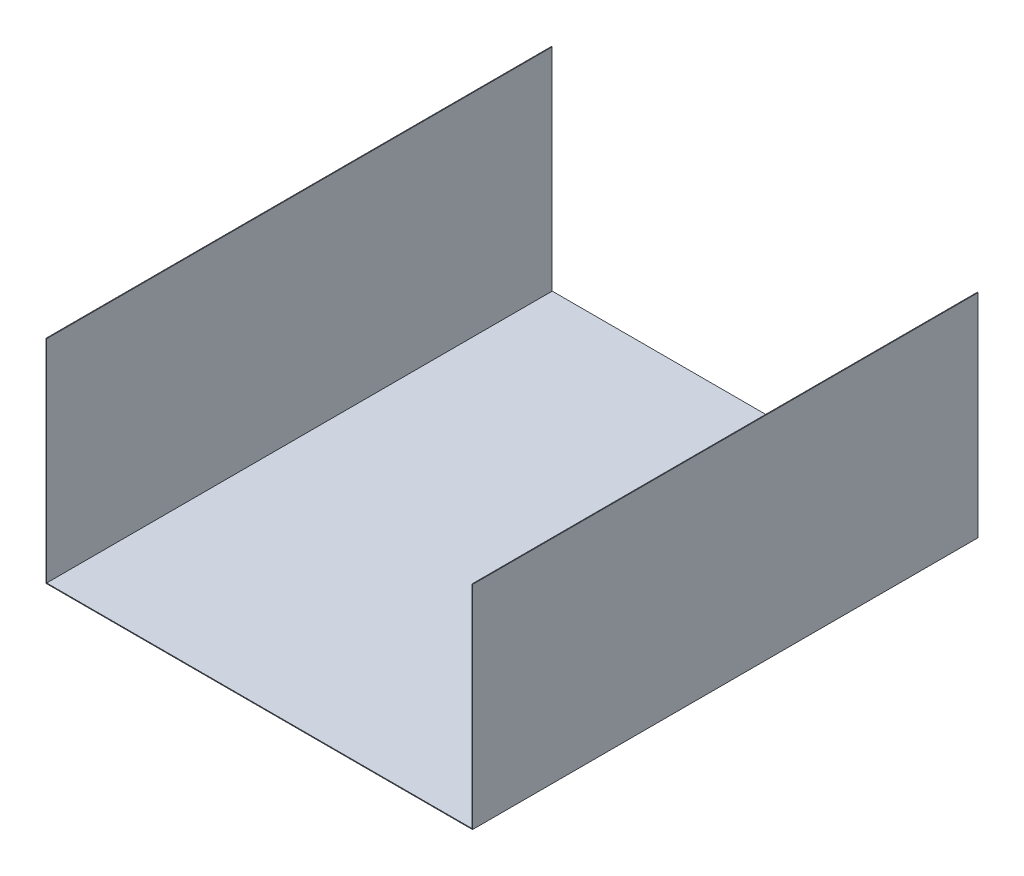
ISO-10303-21;
HEADER;
FILE_DESCRIPTION(('STEP AP214'),'2;1');
FILE_NAME('part.step','',(''),(''),'','','');
FILE_SCHEMA(('AUTOMOTIVE_DESIGN { 1 0 10303 214 1 1 1 1 }'));
ENDSEC;
DATA;
#1=APPLICATION_CONTEXT('core data for automotive mechanical design processes');
#2=APPLICATION_PROTOCOL_DEFINITION('international standard','automotive_design',2000,#1);
#3=PRODUCT_CONTEXT('',#1,'mechanical');
#4=PRODUCT('Part','Part','',(#3));
#5=PRODUCT_RELATED_PRODUCT_CATEGORY('part','',(#4));
#6=PRODUCT_DEFINITION_FORMATION('','',#4);
#7=PRODUCT_DEFINITION_CONTEXT('part definition',#1,'design');
#8=PRODUCT_DEFINITION('design','',#6,#7);
#9=PRODUCT_DEFINITION_SHAPE('','',#8);
#10=(LENGTH_UNIT() NAMED_UNIT(*) SI_UNIT(.MILLI.,.METRE.));
#11=(NAMED_UNIT(*) PLANE_ANGLE_UNIT() SI_UNIT($,.RADIAN.));
#12=(NAMED_UNIT(*) SI_UNIT($,.STERADIAN.) SOLID_ANGLE_UNIT());
#13=UNCERTAINTY_MEASURE_WITH_UNIT(LENGTH_MEASURE(1.E-05),#10,'distance_accuracy_value','');
#14=(GEOMETRIC_REPRESENTATION_CONTEXT(3) GLOBAL_UNCERTAINTY_ASSIGNED_CONTEXT((#13)) GLOBAL_UNIT_ASSIGNED_CONTEXT((#10,
#11,#12)) REPRESENTATION_CONTEXT('',''));
#15=CARTESIAN_POINT('',(0.,0.,0.));
#16=DIRECTION('',(0.,0.,1.));
#17=DIRECTION('',(1.,0.,0.));
#18=AXIS2_PLACEMENT_3D('',#15,#16,#17);
#19=CARTESIAN_POINT('',(14.7,298.,-700.));
#20=DIRECTION('',(0.,1.,0.));
#21=DIRECTION('',(0.,0.,1.));
#22=AXIS2_PLACEMENT_3D('',#19,#20,#21);
#23=PLANE('',#22);
#24=DIRECTION('',(-1.,0.,0.));
#25=VECTOR('',#24,1.);
#26=CARTESIAN_POINT('',(14.7,298.,0.));
#27=LINE('',#26,#25);
#28=CARTESIAN_POINT('',(14.7,298.,0.));
#29=VERTEX_POINT('',#28);
#30=CARTESIAN_POINT('',(13.7,298.,0.));
#31=VERTEX_POINT('',#30);
#32=EDGE_CURVE('E136',#29,#31,#27,.T.);
#33=ORIENTED_EDGE('',*,*,#32,.F.);
#34=DIRECTION('',(0.,0.,1.));
#35=VECTOR('',#34,1.);
#36=CARTESIAN_POINT('',(14.7,298.,-700.));
#37=LINE('',#36,#35);
#38=CARTESIAN_POINT('',(14.7,298.,-700.));
#39=VERTEX_POINT('',#38);
#40=EDGE_CURVE('E11',#39,#29,#37,.T.);
#41=ORIENTED_EDGE('',*,*,#40,.F.);
#42=DIRECTION('',(-1.,0.,0.));
#43=VECTOR('',#42,1.);
#44=CARTESIAN_POINT('',(14.7,298.,-700.));
#45=LINE('',#44,#43);
#46=CARTESIAN_POINT('',(13.7,298.,-700.));
#47=VERTEX_POINT('',#46);
#48=EDGE_CURVE('E156',#39,#47,#45,.T.);
#49=ORIENTED_EDGE('',*,*,#48,.T.);
#50=DIRECTION('',(0.,0.,1.));
#51=VECTOR('',#50,1.);
#52=CARTESIAN_POINT('',(13.7,298.,-700.));
#53=LINE('',#52,#51);
#54=EDGE_CURVE('E42',#47,#31,#53,.T.);
#55=ORIENTED_EDGE('',*,*,#54,.T.);
#56=EDGE_LOOP('',(#33,#41,#49,#55));
#57=FACE_BOUND('',#56,.T.);
#58=ADVANCED_FACE('F39',(#57),#23,.T.);
#59=CARTESIAN_POINT('',(14.7,5.,-700.));
#60=DIRECTION('',(1.,0.,0.));
#61=DIRECTION('',(0.,0.,-1.));
#62=AXIS2_PLACEMENT_3D('',#59,#60,#61);
#63=PLANE('',#62);
#64=DIRECTION('',(0.,1.,0.));
#65=VECTOR('',#64,1.);
#66=CARTESIAN_POINT('',(14.7,5.,0.));
#67=LINE('',#66,#65);
#68=CARTESIAN_POINT('',(14.7,5.,0.));
#69=VERTEX_POINT('',#68);
#70=EDGE_CURVE('E154',#69,#29,#67,.T.);
#71=ORIENTED_EDGE('',*,*,#70,.F.);
#72=DIRECTION('',(0.,0.,1.));
#73=VECTOR('',#72,1.);
#74=CARTESIAN_POINT('',(14.7,5.,-700.));
#75=LINE('',#74,#73);
#76=CARTESIAN_POINT('',(14.7,5.,-700.));
#77=VERTEX_POINT('',#76);
#78=EDGE_CURVE('E48',#77,#69,#75,.T.);
#79=ORIENTED_EDGE('',*,*,#78,.F.);
#80=DIRECTION('',(0.,1.,0.));
#81=VECTOR('',#80,1.);
#82=CARTESIAN_POINT('',(14.7,5.,-700.));
#83=LINE('',#82,#81);
#84=EDGE_CURVE('E126',#77,#39,#83,.T.);
#85=ORIENTED_EDGE('',*,*,#84,.T.);
#86=ORIENTED_EDGE('',*,*,#40,.T.);
#87=EDGE_LOOP('',(#71,#79,#85,#86));
#88=FACE_BOUND('',#87,.T.);
#89=ADVANCED_FACE('F168',(#88),#63,.T.);
#90=CARTESIAN_POINT('',(603.3,5.,-700.));
#91=DIRECTION('',(0.,1.,0.));
#92=DIRECTION('',(0.,0.,1.));
#93=AXIS2_PLACEMENT_3D('',#90,#91,#92);
#94=PLANE('',#93);
#95=DIRECTION('',(-1.,0.,0.));
#96=VECTOR('',#95,1.);
#97=CARTESIAN_POINT('',(603.3,5.,0.));
#98=LINE('',#97,#96);
#99=CARTESIAN_POINT('',(603.3,5.,0.));
#100=VERTEX_POINT('',#99);
#101=EDGE_CURVE('E113',#100,#69,#98,.T.);
#102=ORIENTED_EDGE('',*,*,#101,.F.);
#103=DIRECTION('',(0.,0.,1.));
#104=VECTOR('',#103,1.);
#105=CARTESIAN_POINT('',(603.3,5.,-700.));
#106=LINE('',#105,#104);
#107=CARTESIAN_POINT('',(603.3,5.,-700.));
#108=VERTEX_POINT('',#107);
#109=EDGE_CURVE('E108',#108,#100,#106,.T.);
#110=ORIENTED_EDGE('',*,*,#109,.F.);
#111=DIRECTION('',(-1.,0.,0.));
#112=VECTOR('',#111,1.);
#113=CARTESIAN_POINT('',(603.3,5.,-700.));
#114=LINE('',#113,#112);
#115=EDGE_CURVE('E111',#108,#77,#114,.T.);
#116=ORIENTED_EDGE('',*,*,#115,.T.);
#117=ORIENTED_EDGE('',*,*,#78,.T.);
#118=EDGE_LOOP('',(#102,#110,#116,#117));
#119=FACE_BOUND('',#118,.T.);
#120=ADVANCED_FACE('F110',(#119),#94,.T.);
#121=CARTESIAN_POINT('',(603.3,298.,-700.));
#122=DIRECTION('',(-1.,0.,0.));
#123=DIRECTION('',(0.,0.,1.));
#124=AXIS2_PLACEMENT_3D('',#121,#122,#123);
#125=PLANE('',#124);
#126=DIRECTION('',(0.,-1.,0.));
#127=VECTOR('',#126,1.);
#128=CARTESIAN_POINT('',(603.3,298.,0.));
#129=LINE('',#128,#127);
#130=CARTESIAN_POINT('',(603.3,298.,0.));
#131=VERTEX_POINT('',#130);
#132=EDGE_CURVE('E151',#131,#100,#129,.T.);
#133=ORIENTED_EDGE('',*,*,#132,.F.);
#134=DIRECTION('',(0.,0.,1.));
#135=VECTOR('',#134,1.);
#136=CARTESIAN_POINT('',(603.3,298.,-700.));
#137=LINE('',#136,#135);
#138=CARTESIAN_POINT('',(603.3,298.,-700.));
#139=VERTEX_POINT('',#138);
#140=EDGE_CURVE('E118',#139,#131,#137,.T.);
#141=ORIENTED_EDGE('',*,*,#140,.F.);
#142=DIRECTION('',(0.,-1.,0.));
#143=VECTOR('',#142,1.);
#144=CARTESIAN_POINT('',(603.3,298.,-700.));
#145=LINE('',#144,#143);
#146=EDGE_CURVE('E124',#139,#108,#145,.T.);
#147=ORIENTED_EDGE('',*,*,#146,.T.);
#148=ORIENTED_EDGE('',*,*,#109,.T.);
#149=EDGE_LOOP('',(#133,#141,#147,#148));
#150=FACE_BOUND('',#149,.T.);
#151=ADVANCED_FACE('F128',(#150),#125,.T.);
#152=CARTESIAN_POINT('',(604.3,298.,-700.));
#153=DIRECTION('',(0.,1.,0.));
#154=DIRECTION('',(0.,0.,1.));
#155=AXIS2_PLACEMENT_3D('',#152,#153,#154);
#156=PLANE('',#155);
#157=DIRECTION('',(-1.,0.,0.));
#158=VECTOR('',#157,1.);
#159=CARTESIAN_POINT('',(604.3,298.,0.));
#160=LINE('',#159,#158);
#161=CARTESIAN_POINT('',(604.3,298.,0.));
#162=VERTEX_POINT('',#161);
#163=EDGE_CURVE('E148',#162,#131,#160,.T.);
#164=ORIENTED_EDGE('',*,*,#163,.F.);
#165=DIRECTION('',(0.,0.,1.));
#166=VECTOR('',#165,1.);
#167=CARTESIAN_POINT('',(604.3,298.,-700.));
#168=LINE('',#167,#166);
#169=CARTESIAN_POINT('',(604.3,298.,-700.));
#170=VERTEX_POINT('',#169);
#171=EDGE_CURVE('E160',#170,#162,#168,.T.);
#172=ORIENTED_EDGE('',*,*,#171,.F.);
#173=DIRECTION('',(-1.,0.,0.));
#174=VECTOR('',#173,1.);
#175=CARTESIAN_POINT('',(604.3,298.,-700.));
#176=LINE('',#175,#174);
#177=EDGE_CURVE('E129',#170,#139,#176,.T.);
#178=ORIENTED_EDGE('',*,*,#177,.T.);
#179=ORIENTED_EDGE('',*,*,#140,.T.);
#180=EDGE_LOOP('',(#164,#172,#178,#179));
#181=FACE_BOUND('',#180,.T.);
#182=ADVANCED_FACE('F181',(#181),#156,.T.);
#183=CARTESIAN_POINT('',(604.3,4.,-700.));
#184=DIRECTION('',(1.,0.,0.));
#185=DIRECTION('',(0.,0.,-1.));
#186=AXIS2_PLACEMENT_3D('',#183,#184,#185);
#187=PLANE('',#186);
#188=DIRECTION('',(0.,1.,0.));
#189=VECTOR('',#188,1.);
#190=CARTESIAN_POINT('',(604.3,4.,0.));
#191=LINE('',#190,#189);
#192=CARTESIAN_POINT('',(604.3,4.,0.));
#193=VERTEX_POINT('',#192);
#194=EDGE_CURVE('E145',#193,#162,#191,.T.);
#195=ORIENTED_EDGE('',*,*,#194,.F.);
#196=DIRECTION('',(0.,0.,1.));
#197=VECTOR('',#196,1.);
#198=CARTESIAN_POINT('',(604.3,4.,-700.));
#199=LINE('',#198,#197);
#200=CARTESIAN_POINT('',(604.3,4.,-700.));
#201=VERTEX_POINT('',#200);
#202=EDGE_CURVE('E162',#201,#193,#199,.T.);
#203=ORIENTED_EDGE('',*,*,#202,.F.);
#204=DIRECTION('',(0.,1.,0.));
#205=VECTOR('',#204,1.);
#206=CARTESIAN_POINT('',(604.3,4.,-700.));
#207=LINE('',#206,#205);
#208=EDGE_CURVE('E131',#201,#170,#207,.T.);
#209=ORIENTED_EDGE('',*,*,#208,.T.);
#210=ORIENTED_EDGE('',*,*,#171,.T.);
#211=EDGE_LOOP('',(#195,#203,#209,#210));
#212=FACE_BOUND('',#211,.T.);
#213=ADVANCED_FACE('F184',(#212),#187,.T.);
#214=CARTESIAN_POINT('',(13.7,4.,-700.));
#215=DIRECTION('',(0.,-1.,0.));
#216=DIRECTION('',(0.,0.,-1.));
#217=AXIS2_PLACEMENT_3D('',#214,#215,#216);
#218=PLANE('',#217);
#219=DIRECTION('',(1.,0.,0.));
#220=VECTOR('',#219,1.);
#221=CARTESIAN_POINT('',(13.7,4.,0.));
#222=LINE('',#221,#220);
#223=CARTESIAN_POINT('',(13.7,4.,0.));
#224=VERTEX_POINT('',#223);
#225=EDGE_CURVE('E142',#224,#193,#222,.T.);
#226=ORIENTED_EDGE('',*,*,#225,.F.);
#227=DIRECTION('',(0.,0.,1.));
#228=VECTOR('',#227,1.);
#229=CARTESIAN_POINT('',(13.7,4.,-700.));
#230=LINE('',#229,#228);
#231=CARTESIAN_POINT('',(13.7,4.,-700.));
#232=VERTEX_POINT('',#231);
#233=EDGE_CURVE('E163',#232,#224,#230,.T.);
#234=ORIENTED_EDGE('',*,*,#233,.F.);
#235=DIRECTION('',(1.,0.,0.));
#236=VECTOR('',#235,1.);
#237=CARTESIAN_POINT('',(13.7,4.,-700.));
#238=LINE('',#237,#236);
#239=EDGE_CURVE('E259',#232,#201,#238,.T.);
#240=ORIENTED_EDGE('',*,*,#239,.T.);
#241=ORIENTED_EDGE('',*,*,#202,.T.);
#242=EDGE_LOOP('',(#226,#234,#240,#241));
#243=FACE_BOUND('',#242,.T.);
#244=ADVANCED_FACE('F188',(#243),#218,.T.);
#245=CARTESIAN_POINT('',(13.7,298.,-700.));
#246=DIRECTION('',(-1.,0.,0.));
#247=DIRECTION('',(0.,0.,1.));
#248=AXIS2_PLACEMENT_3D('',#245,#246,#247);
#249=PLANE('',#248);
#250=DIRECTION('',(0.,-1.,0.));
#251=VECTOR('',#250,1.);
#252=CARTESIAN_POINT('',(13.7,298.,0.));
#253=LINE('',#252,#251);
#254=EDGE_CURVE('E139',#31,#224,#253,.T.);
#255=ORIENTED_EDGE('',*,*,#254,.F.);
#256=ORIENTED_EDGE('',*,*,#54,.F.);
#257=DIRECTION('',(0.,-1.,0.));
#258=VECTOR('',#257,1.);
#259=CARTESIAN_POINT('',(13.7,298.,-700.));
#260=LINE('',#259,#258);
#261=EDGE_CURVE('E260',#47,#232,#260,.T.);
#262=ORIENTED_EDGE('',*,*,#261,.T.);
#263=ORIENTED_EDGE('',*,*,#233,.T.);
#264=EDGE_LOOP('',(#255,#256,#262,#263));
#265=FACE_BOUND('',#264,.T.);
#266=ADVANCED_FACE('F165',(#265),#249,.T.);
#267=CARTESIAN_POINT('',(0.,0.,-700.));
#268=DIRECTION('',(0.,0.,1.));
#269=DIRECTION('',(1.,0.,0.));
#270=AXIS2_PLACEMENT_3D('',#267,#268,#269);
#271=PLANE('',#270);
#272=ORIENTED_EDGE('',*,*,#48,.F.);
#273=ORIENTED_EDGE('',*,*,#84,.F.);
#274=ORIENTED_EDGE('',*,*,#115,.F.);
#275=ORIENTED_EDGE('',*,*,#146,.F.);
#276=ORIENTED_EDGE('',*,*,#177,.F.);
#277=ORIENTED_EDGE('',*,*,#208,.F.);
#278=ORIENTED_EDGE('',*,*,#239,.F.);
#279=ORIENTED_EDGE('',*,*,#261,.F.);
#280=EDGE_LOOP('',(#272,#273,#274,#275,#276,#277,#278,#279));
#281=FACE_BOUND('',#280,.T.);
#282=ADVANCED_FACE('F122',(#281),#271,.F.);
#283=CARTESIAN_POINT('',(0.,0.,0.));
#284=DIRECTION('',(0.,0.,1.));
#285=DIRECTION('',(1.,0.,0.));
#286=AXIS2_PLACEMENT_3D('',#283,#284,#285);
#287=PLANE('',#286);
#288=ORIENTED_EDGE('',*,*,#32,.T.);
#289=ORIENTED_EDGE('',*,*,#254,.T.);
#290=ORIENTED_EDGE('',*,*,#225,.T.);
#291=ORIENTED_EDGE('',*,*,#194,.T.);
#292=ORIENTED_EDGE('',*,*,#163,.T.);
#293=ORIENTED_EDGE('',*,*,#132,.T.);
#294=ORIENTED_EDGE('',*,*,#101,.T.);
#295=ORIENTED_EDGE('',*,*,#70,.T.);
#296=EDGE_LOOP('',(#288,#289,#290,#291,#292,#293,#294,#295));
#297=FACE_BOUND('',#296,.T.);
#298=ADVANCED_FACE('F167',(#297),#287,.T.);
#299=CLOSED_SHELL('',(#58,#89,#120,#151,#182,#213,#244,#266,#282,#298));
#300=MANIFOLD_SOLID_BREP('B2',#299);
#301=ADVANCED_BREP_SHAPE_REPRESENTATION('',(#18,#300),#14);
#302=SHAPE_DEFINITION_REPRESENTATION(#9,#301);
ENDSEC;
END-ISO-10303-21;
